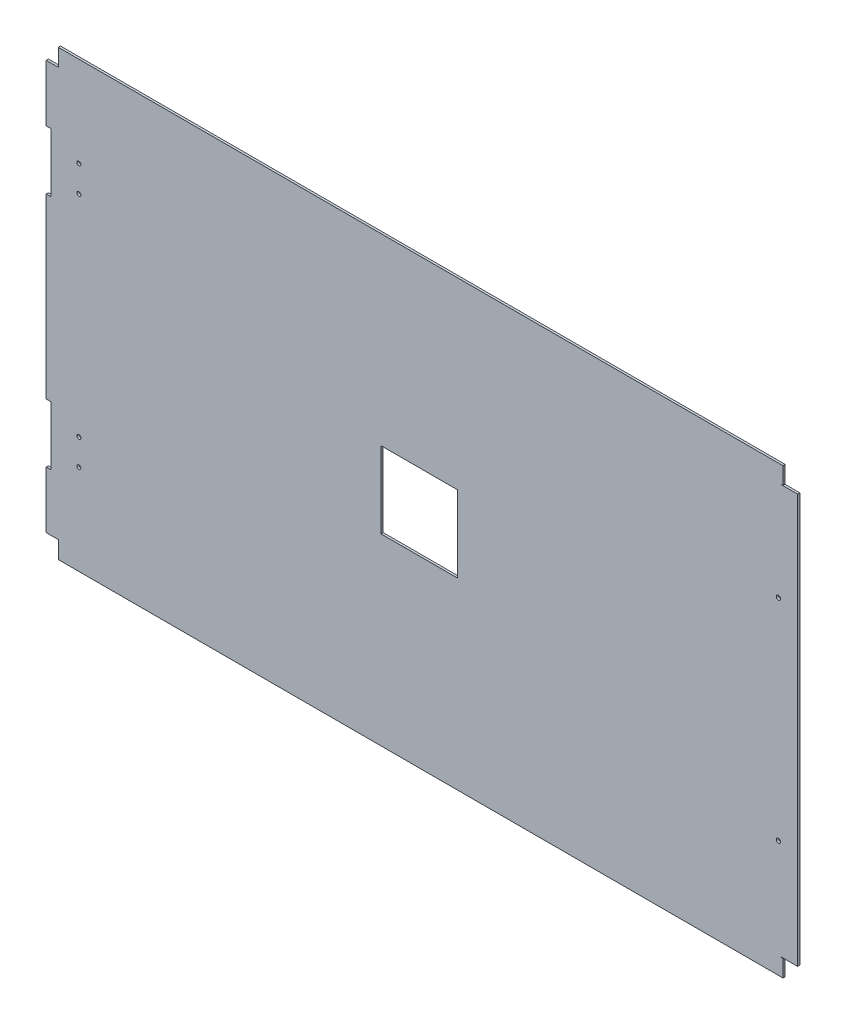
ISO-10303-21;
HEADER;
FILE_DESCRIPTION(('STEP AP214'),'2;1');
FILE_NAME('part.step','',(''),(''),'','','');
FILE_SCHEMA(('AUTOMOTIVE_DESIGN { 1 0 10303 214 1 1 1 1 }'));
ENDSEC;
DATA;
#1=APPLICATION_CONTEXT('core data for automotive mechanical design processes');
#2=APPLICATION_PROTOCOL_DEFINITION('international standard','automotive_design',2000,#1);
#3=PRODUCT_CONTEXT('',#1,'mechanical');
#4=PRODUCT('Part','Part','',(#3));
#5=PRODUCT_RELATED_PRODUCT_CATEGORY('part','',(#4));
#6=PRODUCT_DEFINITION_FORMATION('','',#4);
#7=PRODUCT_DEFINITION_CONTEXT('part definition',#1,'design');
#8=PRODUCT_DEFINITION('design','',#6,#7);
#9=PRODUCT_DEFINITION_SHAPE('','',#8);
#10=(LENGTH_UNIT() NAMED_UNIT(*) SI_UNIT(.MILLI.,.METRE.));
#11=(NAMED_UNIT(*) PLANE_ANGLE_UNIT() SI_UNIT($,.RADIAN.));
#12=(NAMED_UNIT(*) SI_UNIT($,.STERADIAN.) SOLID_ANGLE_UNIT());
#13=UNCERTAINTY_MEASURE_WITH_UNIT(LENGTH_MEASURE(1.E-05),#10,'distance_accuracy_value','');
#14=(GEOMETRIC_REPRESENTATION_CONTEXT(3) GLOBAL_UNCERTAINTY_ASSIGNED_CONTEXT((#13)) GLOBAL_UNIT_ASSIGNED_CONTEXT((#10,
#11,#12)) REPRESENTATION_CONTEXT('',''));
#15=CARTESIAN_POINT('',(0.,0.,0.));
#16=DIRECTION('',(0.,0.,1.));
#17=DIRECTION('',(1.,0.,0.));
#18=AXIS2_PLACEMENT_3D('',#15,#16,#17);
#19=CARTESIAN_POINT('',(0.,0.,-2.667));
#20=DIRECTION('',(0.,0.,-1.));
#21=DIRECTION('',(-1.,0.,0.));
#22=AXIS2_PLACEMENT_3D('',#19,#20,#21);
#23=PLANE('',#22);
#24=CARTESIAN_POINT('',(433.451,-127.,-2.667));
#25=DIRECTION('',(0.,0.,-1.));
#26=DIRECTION('',(-1.,0.,0.));
#27=AXIS2_PLACEMENT_3D('',#24,#25,#26);
#28=CIRCLE('',#27,2.54000000000001);
#29=CARTESIAN_POINT('',(430.911,-127.,-2.667));
#30=VERTEX_POINT('',#29);
#31=EDGE_CURVE('E467',#30,#30,#28,.F.);
#32=ORIENTED_EDGE('',*,*,#31,.T.);
#33=EDGE_LOOP('',(#32));
#34=FACE_BOUND('',#33,.T.);
#35=CARTESIAN_POINT('',(433.451,127.,-2.667));
#36=DIRECTION('',(0.,0.,-1.));
#37=DIRECTION('',(-1.,0.,0.));
#38=AXIS2_PLACEMENT_3D('',#35,#36,#37);
#39=CIRCLE('',#38,2.54000000000001);
#40=CARTESIAN_POINT('',(430.911,127.,-2.667));
#41=VERTEX_POINT('',#40);
#42=EDGE_CURVE('E461',#41,#41,#39,.F.);
#43=ORIENTED_EDGE('',*,*,#42,.T.);
#44=EDGE_LOOP('',(#43));
#45=FACE_BOUND('',#44,.T.);
#46=CARTESIAN_POINT('',(-410.845,-158.75,-2.667));
#47=DIRECTION('',(0.,0.,-1.));
#48=DIRECTION('',(-1.,0.,0.));
#49=AXIS2_PLACEMENT_3D('',#46,#47,#48);
#50=CIRCLE('',#49,2.413);
#51=CARTESIAN_POINT('',(-413.258,-158.75,-2.667));
#52=VERTEX_POINT('',#51);
#53=EDGE_CURVE('E455',#52,#52,#50,.F.);
#54=ORIENTED_EDGE('',*,*,#53,.T.);
#55=EDGE_LOOP('',(#54));
#56=FACE_BOUND('',#55,.T.);
#57=CARTESIAN_POINT('',(-410.845,-127.,-2.667));
#58=DIRECTION('',(0.,0.,-1.));
#59=DIRECTION('',(-1.,0.,0.));
#60=AXIS2_PLACEMENT_3D('',#57,#58,#59);
#61=CIRCLE('',#60,2.413);
#62=CARTESIAN_POINT('',(-413.258,-127.,-2.667));
#63=VERTEX_POINT('',#62);
#64=EDGE_CURVE('E449',#63,#63,#61,.F.);
#65=ORIENTED_EDGE('',*,*,#64,.T.);
#66=EDGE_LOOP('',(#65));
#67=FACE_BOUND('',#66,.T.);
#68=CARTESIAN_POINT('',(-410.845,127.,-2.667));
#69=DIRECTION('',(0.,0.,-1.));
#70=DIRECTION('',(-1.,0.,0.));
#71=AXIS2_PLACEMENT_3D('',#68,#69,#70);
#72=CIRCLE('',#71,2.413);
#73=CARTESIAN_POINT('',(-413.258,127.,-2.667));
#74=VERTEX_POINT('',#73);
#75=EDGE_CURVE('E443',#74,#74,#72,.F.);
#76=ORIENTED_EDGE('',*,*,#75,.T.);
#77=EDGE_LOOP('',(#76));
#78=FACE_BOUND('',#77,.T.);
#79=CARTESIAN_POINT('',(-410.845,158.75,-2.667));
#80=DIRECTION('',(0.,0.,-1.));
#81=DIRECTION('',(-1.,0.,0.));
#82=AXIS2_PLACEMENT_3D('',#79,#80,#81);
#83=CIRCLE('',#82,2.413);
#84=CARTESIAN_POINT('',(-413.258,158.75,-2.667));
#85=VERTEX_POINT('',#84);
#86=EDGE_CURVE('E436',#85,#85,#83,.F.);
#87=ORIENTED_EDGE('',*,*,#86,.T.);
#88=EDGE_LOOP('',(#87));
#89=FACE_BOUND('',#88,.T.);
#90=DIRECTION('',(0.,1.,0.));
#91=VECTOR('',#90,1.);
#92=CARTESIAN_POINT('',(45.9740000000002,-46.101,-2.667));
#93=LINE('',#92,#91);
#94=CARTESIAN_POINT('',(45.9740000000002,-46.101,-2.667));
#95=VERTEX_POINT('',#94);
#96=CARTESIAN_POINT('',(45.9740000000002,46.1009999999999,-2.667));
#97=VERTEX_POINT('',#96);
#98=EDGE_CURVE('E477',#95,#97,#93,.T.);
#99=ORIENTED_EDGE('',*,*,#98,.T.);
#100=DIRECTION('',(-1.,0.,0.));
#101=VECTOR('',#100,1.);
#102=CARTESIAN_POINT('',(-46.2279999999998,46.1009999999999,-2.667));
#103=LINE('',#102,#101);
#104=CARTESIAN_POINT('',(-46.2279999999998,46.1009999999999,-2.667));
#105=VERTEX_POINT('',#104);
#106=EDGE_CURVE('E492',#97,#105,#103,.T.);
#107=ORIENTED_EDGE('',*,*,#106,.T.);
#108=DIRECTION('',(0.,-1.,0.));
#109=VECTOR('',#108,1.);
#110=CARTESIAN_POINT('',(-46.2279999999998,-46.101,-2.667));
#111=LINE('',#110,#109);
#112=CARTESIAN_POINT('',(-46.2279999999998,-46.101,-2.667));
#113=VERTEX_POINT('',#112);
#114=EDGE_CURVE('E439',#105,#113,#111,.T.);
#115=ORIENTED_EDGE('',*,*,#114,.T.);
#116=DIRECTION('',(1.,0.,0.));
#117=VECTOR('',#116,1.);
#118=CARTESIAN_POINT('',(-46.2279999999998,-46.101,-2.667));
#119=LINE('',#118,#117);
#120=EDGE_CURVE('E474',#113,#95,#119,.T.);
#121=ORIENTED_EDGE('',*,*,#120,.T.);
#122=EDGE_LOOP('',(#99,#107,#115,#121));
#123=FACE_BOUND('',#122,.T.);
#124=DIRECTION('',(-1.,0.,0.));
#125=VECTOR('',#124,1.);
#126=CARTESIAN_POINT('',(-442.087,-246.888,-2.667));
#127=LINE('',#126,#125);
#128=CARTESIAN_POINT('',(-435.737,-246.888,-2.667));
#129=VERTEX_POINT('',#128);
#130=CARTESIAN_POINT('',(-450.277291291236,-246.888,-2.66699999999992));
#131=VERTEX_POINT('',#130);
#132=EDGE_CURVE('E539',#129,#131,#127,.T.);
#133=ORIENTED_EDGE('',*,*,#132,.T.);
#134=DIRECTION('',(0.,-1.,0.));
#135=VECTOR('',#134,1.);
#136=CARTESIAN_POINT('',(-450.277291291236,0.,-2.66699999999992));
#137=LINE('',#136,#135);
#138=CARTESIAN_POINT('',(-450.277291291236,-178.308,-2.66699999999992));
#139=VERTEX_POINT('',#138);
#140=EDGE_CURVE('E374',#131,#139,#137,.F.);
#141=ORIENTED_EDGE('',*,*,#140,.T.);
#142=DIRECTION('',(-1.,0.,0.));
#143=VECTOR('',#142,1.);
#144=CARTESIAN_POINT('',(-450.277291291236,-178.308,-2.66699999999992));
#145=LINE('',#144,#143);
#146=CARTESIAN_POINT('',(-444.435291291236,-178.308,-2.66700000000009));
#147=VERTEX_POINT('',#146);
#148=EDGE_CURVE('E420',#147,#139,#145,.T.);
#149=ORIENTED_EDGE('',*,*,#148,.F.);
#150=DIRECTION('',(0.,-1.,0.));
#151=VECTOR('',#150,1.);
#152=CARTESIAN_POINT('',(-444.435291291236,-178.308,-2.66700000000009));
#153=LINE('',#152,#151);
#154=CARTESIAN_POINT('',(-444.435291291236,-107.188,-2.66700000000009));
#155=VERTEX_POINT('',#154);
#156=EDGE_CURVE('E427',#155,#147,#153,.T.);
#157=ORIENTED_EDGE('',*,*,#156,.F.);
#158=DIRECTION('',(1.,0.,0.));
#159=VECTOR('',#158,1.);
#160=CARTESIAN_POINT('',(-450.277291291236,-107.188,-2.66699999999992));
#161=LINE('',#160,#159);
#162=CARTESIAN_POINT('',(-450.277291291236,-107.188,-2.66699999999992));
#163=VERTEX_POINT('',#162);
#164=EDGE_CURVE('E361',#163,#155,#161,.T.);
#165=ORIENTED_EDGE('',*,*,#164,.F.);
#166=CARTESIAN_POINT('',(-450.277291291236,107.188,-2.66699999999992));
#167=VERTEX_POINT('',#166);
#168=EDGE_CURVE('E378',#163,#167,#137,.F.);
#169=ORIENTED_EDGE('',*,*,#168,.T.);
#170=DIRECTION('',(-1.,0.,0.));
#171=VECTOR('',#170,1.);
#172=CARTESIAN_POINT('',(-450.277291291236,107.188,-2.66699999999992));
#173=LINE('',#172,#171);
#174=CARTESIAN_POINT('',(-444.435291291236,107.188,-2.66700000000009));
#175=VERTEX_POINT('',#174);
#176=EDGE_CURVE('E394',#175,#167,#173,.T.);
#177=ORIENTED_EDGE('',*,*,#176,.F.);
#178=DIRECTION('',(0.,-1.,0.));
#179=VECTOR('',#178,1.);
#180=CARTESIAN_POINT('',(-444.435291291236,178.308,-2.66700000000009));
#181=LINE('',#180,#179);
#182=CARTESIAN_POINT('',(-444.435291291236,178.308,-2.66700000000009));
#183=VERTEX_POINT('',#182);
#184=EDGE_CURVE('E401',#183,#175,#181,.T.);
#185=ORIENTED_EDGE('',*,*,#184,.F.);
#186=DIRECTION('',(1.,0.,0.));
#187=VECTOR('',#186,1.);
#188=CARTESIAN_POINT('',(-450.277291291236,178.308,-2.66699999999992));
#189=LINE('',#188,#187);
#190=CARTESIAN_POINT('',(-450.277291291236,178.308,-2.66699999999992));
#191=VERTEX_POINT('',#190);
#192=EDGE_CURVE('E408',#191,#183,#189,.T.);
#193=ORIENTED_EDGE('',*,*,#192,.F.);
#194=CARTESIAN_POINT('',(-450.277291291236,246.888,-2.66699999999992));
#195=VERTEX_POINT('',#194);
#196=EDGE_CURVE('E377',#191,#195,#137,.F.);
#197=ORIENTED_EDGE('',*,*,#196,.T.);
#198=DIRECTION('',(1.,0.,0.));
#199=VECTOR('',#198,1.);
#200=CARTESIAN_POINT('',(-442.087,246.888,-2.667));
#201=LINE('',#200,#199);
#202=CARTESIAN_POINT('',(-435.737,246.888,-2.667));
#203=VERTEX_POINT('',#202);
#204=EDGE_CURVE('E549',#195,#203,#201,.T.);
#205=ORIENTED_EDGE('',*,*,#204,.T.);
#206=DIRECTION('',(0.,1.,0.));
#207=VECTOR('',#206,1.);
#208=CARTESIAN_POINT('',(-435.737,253.238,-2.667));
#209=LINE('',#208,#207);
#210=CARTESIAN_POINT('',(-435.737,267.778291291236,-2.66699999999986));
#211=VERTEX_POINT('',#210);
#212=EDGE_CURVE('E331',#203,#211,#209,.T.);
#213=ORIENTED_EDGE('',*,*,#212,.T.);
#214=DIRECTION('',(1.,0.,0.));
#215=VECTOR('',#214,1.);
#216=CARTESIAN_POINT('',(-435.737,267.778291291236,-2.66699999999986));
#217=LINE('',#216,#215);
#218=CARTESIAN_POINT('',(439.039,267.778291291236,-2.66699999999986));
#219=VERTEX_POINT('',#218);
#220=EDGE_CURVE('E329',#219,#211,#217,.F.);
#221=ORIENTED_EDGE('',*,*,#220,.F.);
#222=DIRECTION('',(0.,-1.,0.));
#223=VECTOR('',#222,1.);
#224=CARTESIAN_POINT('',(439.039,253.238,-2.667));
#225=LINE('',#224,#223);
#226=CARTESIAN_POINT('',(439.039,247.1547,-2.667));
#227=VERTEX_POINT('',#226);
#228=EDGE_CURVE('E315',#219,#227,#225,.T.);
#229=ORIENTED_EDGE('',*,*,#228,.T.);
#230=DIRECTION('',(1.,0.,0.));
#231=VECTOR('',#230,1.);
#232=CARTESIAN_POINT('',(436.4863,247.1547,-2.66699999999998));
#233=LINE('',#232,#231);
#234=CARTESIAN_POINT('',(436.4863,247.1547,-2.667));
#235=VERTEX_POINT('',#234);
#236=EDGE_CURVE('E518',#235,#227,#233,.T.);
#237=ORIENTED_EDGE('',*,*,#236,.F.);
#238=DIRECTION('',(0.,1.,0.));
#239=VECTOR('',#238,1.);
#240=CARTESIAN_POINT('',(436.4863,246.888,-2.66699999999998));
#241=LINE('',#240,#239);
#242=CARTESIAN_POINT('',(436.4863,246.888,-2.667));
#243=VERTEX_POINT('',#242);
#244=EDGE_CURVE('E514',#243,#235,#241,.T.);
#245=ORIENTED_EDGE('',*,*,#244,.F.);
#246=DIRECTION('',(-1.,0.,0.));
#247=VECTOR('',#246,1.);
#248=CARTESIAN_POINT('',(436.753,246.888,-2.66699999999998));
#249=LINE('',#248,#247);
#250=CARTESIAN_POINT('',(456.627291291236,246.888,-2.66699999999986));
#251=VERTEX_POINT('',#250);
#252=EDGE_CURVE('E511',#251,#243,#249,.T.);
#253=ORIENTED_EDGE('',*,*,#252,.F.);
#254=DIRECTION('',(0.,-1.,0.));
#255=VECTOR('',#254,1.);
#256=CARTESIAN_POINT('',(456.627291291236,246.888,-2.66699999999986));
#257=LINE('',#256,#255);
#258=CARTESIAN_POINT('',(456.627291291236,-246.888,-2.66699999999981));
#259=VERTEX_POINT('',#258);
#260=EDGE_CURVE('E355',#259,#251,#257,.F.);
#261=ORIENTED_EDGE('',*,*,#260,.F.);
#262=DIRECTION('',(1.,0.,0.));
#263=VECTOR('',#262,1.);
#264=CARTESIAN_POINT('',(436.4863,-246.888,-2.66699999999998));
#265=LINE('',#264,#263);
#266=CARTESIAN_POINT('',(436.4863,-246.888,-2.667));
#267=VERTEX_POINT('',#266);
#268=EDGE_CURVE('E508',#267,#259,#265,.T.);
#269=ORIENTED_EDGE('',*,*,#268,.F.);
#270=DIRECTION('',(0.,1.,0.));
#271=VECTOR('',#270,1.);
#272=CARTESIAN_POINT('',(436.4863,-247.1547,-2.66699999999998));
#273=LINE('',#272,#271);
#274=CARTESIAN_POINT('',(436.4863,-247.1547,-2.667));
#275=VERTEX_POINT('',#274);
#276=EDGE_CURVE('E504',#275,#267,#273,.T.);
#277=ORIENTED_EDGE('',*,*,#276,.F.);
#278=DIRECTION('',(-1.,0.,0.));
#279=VECTOR('',#278,1.);
#280=CARTESIAN_POINT('',(442.087,-247.1547,-2.66699999999998));
#281=LINE('',#280,#279);
#282=CARTESIAN_POINT('',(439.039,-247.1547,-2.66699999999998));
#283=VERTEX_POINT('',#282);
#284=EDGE_CURVE('E500',#283,#275,#281,.T.);
#285=ORIENTED_EDGE('',*,*,#284,.F.);
#286=DIRECTION('',(0.,-1.,0.));
#287=VECTOR('',#286,1.);
#288=CARTESIAN_POINT('',(439.039,-253.238,-2.667));
#289=LINE('',#288,#287);
#290=CARTESIAN_POINT('',(439.039,-267.778291291236,-2.66699999999986));
#291=VERTEX_POINT('',#290);
#292=EDGE_CURVE('E533',#283,#291,#289,.T.);
#293=ORIENTED_EDGE('',*,*,#292,.T.);
#294=DIRECTION('',(-1.,0.,0.));
#295=VECTOR('',#294,1.);
#296=CARTESIAN_POINT('',(439.039,-267.778291291236,-2.66699999999986));
#297=LINE('',#296,#295);
#298=CARTESIAN_POINT('',(-435.737,-267.778291291236,-2.66699999999986));
#299=VERTEX_POINT('',#298);
#300=EDGE_CURVE('E348',#299,#291,#297,.F.);
#301=ORIENTED_EDGE('',*,*,#300,.F.);
#302=DIRECTION('',(0.,1.,0.));
#303=VECTOR('',#302,1.);
#304=CARTESIAN_POINT('',(-435.737,-253.238,-2.667));
#305=LINE('',#304,#303);
#306=EDGE_CURVE('E543',#299,#129,#305,.T.);
#307=ORIENTED_EDGE('',*,*,#306,.T.);
#308=EDGE_LOOP('',(#133,#141,#149,#157,#165,#169,#177,#185,#193,#197,#205,#213,#221,#229,#237,
#245,#253,#261,#269,#277,#285,#293,#301,#307));
#309=FACE_BOUND('',#308,.T.);
#310=ADVANCED_FACE('F129',(#34,#45,#56,#67,#78,#89,#123,#309),#23,.T.);
#311=CARTESIAN_POINT('',(0.,0.,0.));
#312=DIRECTION('',(0.,0.,-1.));
#313=DIRECTION('',(-1.,0.,0.));
#314=AXIS2_PLACEMENT_3D('',#311,#312,#313);
#315=PLANE('',#314);
#316=CARTESIAN_POINT('',(433.451,-127.,0.));
#317=DIRECTION('',(0.,0.,1.));
#318=DIRECTION('',(1.,0.,0.));
#319=AXIS2_PLACEMENT_3D('',#316,#317,#318);
#320=CIRCLE('',#319,2.54000000000001);
#321=CARTESIAN_POINT('',(435.991,-127.,0.));
#322=VERTEX_POINT('',#321);
#323=EDGE_CURVE('E373',#322,#322,#320,.T.);
#324=ORIENTED_EDGE('',*,*,#323,.F.);
#325=EDGE_LOOP('',(#324));
#326=FACE_BOUND('',#325,.T.);
#327=CARTESIAN_POINT('',(433.451,127.,0.));
#328=DIRECTION('',(0.,0.,1.));
#329=DIRECTION('',(1.,0.,0.));
#330=AXIS2_PLACEMENT_3D('',#327,#328,#329);
#331=CIRCLE('',#330,2.54000000000001);
#332=CARTESIAN_POINT('',(435.991,127.,0.));
#333=VERTEX_POINT('',#332);
#334=EDGE_CURVE('E464',#333,#333,#331,.T.);
#335=ORIENTED_EDGE('',*,*,#334,.F.);
#336=EDGE_LOOP('',(#335));
#337=FACE_BOUND('',#336,.T.);
#338=CARTESIAN_POINT('',(-410.845,-158.75,0.));
#339=DIRECTION('',(0.,0.,1.));
#340=DIRECTION('',(1.,0.,0.));
#341=AXIS2_PLACEMENT_3D('',#338,#339,#340);
#342=CIRCLE('',#341,2.413);
#343=CARTESIAN_POINT('',(-408.432,-158.75,0.));
#344=VERTEX_POINT('',#343);
#345=EDGE_CURVE('E458',#344,#344,#342,.T.);
#346=ORIENTED_EDGE('',*,*,#345,.F.);
#347=EDGE_LOOP('',(#346));
#348=FACE_BOUND('',#347,.T.);
#349=CARTESIAN_POINT('',(-410.845,-127.,0.));
#350=DIRECTION('',(0.,0.,1.));
#351=DIRECTION('',(1.,0.,0.));
#352=AXIS2_PLACEMENT_3D('',#349,#350,#351);
#353=CIRCLE('',#352,2.413);
#354=CARTESIAN_POINT('',(-408.432,-127.,0.));
#355=VERTEX_POINT('',#354);
#356=EDGE_CURVE('E452',#355,#355,#353,.T.);
#357=ORIENTED_EDGE('',*,*,#356,.F.);
#358=EDGE_LOOP('',(#357));
#359=FACE_BOUND('',#358,.T.);
#360=CARTESIAN_POINT('',(-410.845,127.,0.));
#361=DIRECTION('',(0.,0.,1.));
#362=DIRECTION('',(1.,0.,0.));
#363=AXIS2_PLACEMENT_3D('',#360,#361,#362);
#364=CIRCLE('',#363,2.413);
#365=CARTESIAN_POINT('',(-408.432,127.,0.));
#366=VERTEX_POINT('',#365);
#367=EDGE_CURVE('E446',#366,#366,#364,.T.);
#368=ORIENTED_EDGE('',*,*,#367,.F.);
#369=EDGE_LOOP('',(#368));
#370=FACE_BOUND('',#369,.T.);
#371=CARTESIAN_POINT('',(-410.845,158.75,0.));
#372=DIRECTION('',(0.,0.,1.));
#373=DIRECTION('',(1.,0.,0.));
#374=AXIS2_PLACEMENT_3D('',#371,#372,#373);
#375=CIRCLE('',#374,2.413);
#376=CARTESIAN_POINT('',(-408.432,158.75,0.));
#377=VERTEX_POINT('',#376);
#378=EDGE_CURVE('E440',#377,#377,#375,.T.);
#379=ORIENTED_EDGE('',*,*,#378,.F.);
#380=EDGE_LOOP('',(#379));
#381=FACE_BOUND('',#380,.T.);
#382=DIRECTION('',(-1.,0.,0.));
#383=VECTOR('',#382,1.);
#384=CARTESIAN_POINT('',(-46.2279999999998,46.1009999999999,0.));
#385=LINE('',#384,#383);
#386=CARTESIAN_POINT('',(45.9740000000002,46.1009999999999,0.));
#387=VERTEX_POINT('',#386);
#388=CARTESIAN_POINT('',(-46.2279999999998,46.1009999999999,0.));
#389=VERTEX_POINT('',#388);
#390=EDGE_CURVE('E481',#387,#389,#385,.T.);
#391=ORIENTED_EDGE('',*,*,#390,.F.);
#392=DIRECTION('',(0.,1.,0.));
#393=VECTOR('',#392,1.);
#394=CARTESIAN_POINT('',(45.9740000000002,-46.101,0.));
#395=LINE('',#394,#393);
#396=CARTESIAN_POINT('',(45.9740000000002,-46.101,0.));
#397=VERTEX_POINT('',#396);
#398=EDGE_CURVE('E152',#397,#387,#395,.T.);
#399=ORIENTED_EDGE('',*,*,#398,.F.);
#400=DIRECTION('',(1.,0.,0.));
#401=VECTOR('',#400,1.);
#402=CARTESIAN_POINT('',(-46.2279999999998,-46.101,0.));
#403=LINE('',#402,#401);
#404=CARTESIAN_POINT('',(-46.2279999999998,-46.101,0.));
#405=VERTEX_POINT('',#404);
#406=EDGE_CURVE('E486',#405,#397,#403,.T.);
#407=ORIENTED_EDGE('',*,*,#406,.F.);
#408=DIRECTION('',(0.,-1.,0.));
#409=VECTOR('',#408,1.);
#410=CARTESIAN_POINT('',(-46.2279999999998,-46.101,0.));
#411=LINE('',#410,#409);
#412=EDGE_CURVE('E483',#389,#405,#411,.T.);
#413=ORIENTED_EDGE('',*,*,#412,.F.);
#414=EDGE_LOOP('',(#391,#399,#407,#413));
#415=FACE_BOUND('',#414,.T.);
#416=DIRECTION('',(1.,0.,0.));
#417=VECTOR('',#416,1.);
#418=CARTESIAN_POINT('',(-442.087,246.888,0.));
#419=LINE('',#418,#417);
#420=CARTESIAN_POINT('',(-450.277291291236,246.888,0.));
#421=VERTEX_POINT('',#420);
#422=CARTESIAN_POINT('',(-435.737,246.888,0.));
#423=VERTEX_POINT('',#422);
#424=EDGE_CURVE('E545',#421,#423,#419,.T.);
#425=ORIENTED_EDGE('',*,*,#424,.F.);
#426=DIRECTION('',(0.,1.,0.));
#427=VECTOR('',#426,1.);
#428=CARTESIAN_POINT('',(-450.277291291236,246.888,0.));
#429=LINE('',#428,#427);
#430=CARTESIAN_POINT('',(-450.277291291236,178.308,0.));
#431=VERTEX_POINT('',#430);
#432=EDGE_CURVE('E384',#431,#421,#429,.T.);
#433=ORIENTED_EDGE('',*,*,#432,.F.);
#434=DIRECTION('',(-1.,0.,0.));
#435=VECTOR('',#434,1.);
#436=CARTESIAN_POINT('',(-450.277291291236,178.308,0.));
#437=LINE('',#436,#435);
#438=CARTESIAN_POINT('',(-444.435291291236,178.308,0.));
#439=VERTEX_POINT('',#438);
#440=EDGE_CURVE('E404',#439,#431,#437,.T.);
#441=ORIENTED_EDGE('',*,*,#440,.F.);
#442=DIRECTION('',(0.,1.,0.));
#443=VECTOR('',#442,1.);
#444=CARTESIAN_POINT('',(-444.435291291236,178.308,0.));
#445=LINE('',#444,#443);
#446=CARTESIAN_POINT('',(-444.435291291236,107.188,0.));
#447=VERTEX_POINT('',#446);
#448=EDGE_CURVE('E396',#447,#439,#445,.T.);
#449=ORIENTED_EDGE('',*,*,#448,.F.);
#450=DIRECTION('',(1.,0.,0.));
#451=VECTOR('',#450,1.);
#452=CARTESIAN_POINT('',(-450.277291291236,107.188,0.));
#453=LINE('',#452,#451);
#454=CARTESIAN_POINT('',(-450.277291291236,107.188,0.));
#455=VERTEX_POINT('',#454);
#456=EDGE_CURVE('E389',#455,#447,#453,.T.);
#457=ORIENTED_EDGE('',*,*,#456,.F.);
#458=CARTESIAN_POINT('',(-450.277291291236,-107.188,0.));
#459=VERTEX_POINT('',#458);
#460=EDGE_CURVE('E385',#459,#455,#429,.T.);
#461=ORIENTED_EDGE('',*,*,#460,.F.);
#462=DIRECTION('',(-1.,0.,0.));
#463=VECTOR('',#462,1.);
#464=CARTESIAN_POINT('',(-450.277291291236,-107.188,0.));
#465=LINE('',#464,#463);
#466=CARTESIAN_POINT('',(-444.435291291236,-107.188,0.));
#467=VERTEX_POINT('',#466);
#468=EDGE_CURVE('E430',#467,#459,#465,.T.);
#469=ORIENTED_EDGE('',*,*,#468,.F.);
#470=DIRECTION('',(0.,1.,0.));
#471=VECTOR('',#470,1.);
#472=CARTESIAN_POINT('',(-444.435291291236,-178.308,0.));
#473=LINE('',#472,#471);
#474=CARTESIAN_POINT('',(-444.435291291236,-178.308,0.));
#475=VERTEX_POINT('',#474);
#476=EDGE_CURVE('E422',#475,#467,#473,.T.);
#477=ORIENTED_EDGE('',*,*,#476,.F.);
#478=DIRECTION('',(1.,0.,0.));
#479=VECTOR('',#478,1.);
#480=CARTESIAN_POINT('',(-450.277291291236,-178.308,0.));
#481=LINE('',#480,#479);
#482=CARTESIAN_POINT('',(-450.277291291236,-178.308,0.));
#483=VERTEX_POINT('',#482);
#484=EDGE_CURVE('E383',#483,#475,#481,.T.);
#485=ORIENTED_EDGE('',*,*,#484,.F.);
#486=CARTESIAN_POINT('',(-450.277291291236,-246.888,0.));
#487=VERTEX_POINT('',#486);
#488=EDGE_CURVE('E379',#487,#483,#429,.T.);
#489=ORIENTED_EDGE('',*,*,#488,.F.);
#490=DIRECTION('',(-1.,0.,0.));
#491=VECTOR('',#490,1.);
#492=CARTESIAN_POINT('',(-442.087,-246.888,0.));
#493=LINE('',#492,#491);
#494=CARTESIAN_POINT('',(-435.737,-246.888,0.));
#495=VERTEX_POINT('',#494);
#496=EDGE_CURVE('E540',#495,#487,#493,.T.);
#497=ORIENTED_EDGE('',*,*,#496,.F.);
#498=DIRECTION('',(0.,1.,0.));
#499=VECTOR('',#498,1.);
#500=CARTESIAN_POINT('',(-435.737,-253.238,0.));
#501=LINE('',#500,#499);
#502=CARTESIAN_POINT('',(-435.737,-267.778291291236,1.11022302462516E-13));
#503=VERTEX_POINT('',#502);
#504=EDGE_CURVE('E542',#503,#495,#501,.T.);
#505=ORIENTED_EDGE('',*,*,#504,.F.);
#506=DIRECTION('',(1.,0.,0.));
#507=VECTOR('',#506,1.);
#508=CARTESIAN_POINT('',(0.,-267.778291291236,1.11022302462516E-13));
#509=LINE('',#508,#507);
#510=CARTESIAN_POINT('',(439.039,-267.778291291236,1.11022302462516E-13));
#511=VERTEX_POINT('',#510);
#512=EDGE_CURVE('E358',#503,#511,#509,.T.);
#513=ORIENTED_EDGE('',*,*,#512,.T.);
#514=DIRECTION('',(0.,-1.,0.));
#515=VECTOR('',#514,1.);
#516=CARTESIAN_POINT('',(439.039,-253.238,0.));
#517=LINE('',#516,#515);
#518=CARTESIAN_POINT('',(439.039,-247.1547,0.));
#519=VERTEX_POINT('',#518);
#520=EDGE_CURVE('E326',#519,#511,#517,.T.);
#521=ORIENTED_EDGE('',*,*,#520,.F.);
#522=DIRECTION('',(1.,0.,0.));
#523=VECTOR('',#522,1.);
#524=CARTESIAN_POINT('',(0.,-247.1547,0.));
#525=LINE('',#524,#523);
#526=CARTESIAN_POINT('',(436.4863,-247.1547,0.));
#527=VERTEX_POINT('',#526);
#528=EDGE_CURVE('E503',#527,#519,#525,.T.);
#529=ORIENTED_EDGE('',*,*,#528,.F.);
#530=DIRECTION('',(0.,-1.,0.));
#531=VECTOR('',#530,1.);
#532=CARTESIAN_POINT('',(436.4863,0.,0.));
#533=LINE('',#532,#531);
#534=CARTESIAN_POINT('',(436.4863,-246.888,0.));
#535=VERTEX_POINT('',#534);
#536=EDGE_CURVE('E13',#535,#527,#533,.T.);
#537=ORIENTED_EDGE('',*,*,#536,.F.);
#538=DIRECTION('',(-1.,0.,0.));
#539=VECTOR('',#538,1.);
#540=CARTESIAN_POINT('',(0.,-246.888,0.));
#541=LINE('',#540,#539);
#542=CARTESIAN_POINT('',(456.627291291236,-246.888,1.66533453693773E-13));
#543=VERTEX_POINT('',#542);
#544=EDGE_CURVE('E137',#543,#535,#541,.T.);
#545=ORIENTED_EDGE('',*,*,#544,.F.);
#546=DIRECTION('',(0.,1.,0.));
#547=VECTOR('',#546,1.);
#548=CARTESIAN_POINT('',(456.627291291236,0.,1.11022302462516E-13));
#549=LINE('',#548,#547);
#550=CARTESIAN_POINT('',(456.627291291236,246.888,1.11022302462516E-13));
#551=VERTEX_POINT('',#550);
#552=EDGE_CURVE('E345',#543,#551,#549,.T.);
#553=ORIENTED_EDGE('',*,*,#552,.T.);
#554=DIRECTION('',(1.,0.,0.));
#555=VECTOR('',#554,1.);
#556=CARTESIAN_POINT('',(0.,246.888,0.));
#557=LINE('',#556,#555);
#558=CARTESIAN_POINT('',(436.4863,246.888,0.));
#559=VERTEX_POINT('',#558);
#560=EDGE_CURVE('E565',#559,#551,#557,.T.);
#561=ORIENTED_EDGE('',*,*,#560,.F.);
#562=DIRECTION('',(0.,-1.,0.));
#563=VECTOR('',#562,1.);
#564=CARTESIAN_POINT('',(436.4863,0.,0.));
#565=LINE('',#564,#563);
#566=CARTESIAN_POINT('',(436.4863,247.1547,0.));
#567=VERTEX_POINT('',#566);
#568=EDGE_CURVE('E562',#567,#559,#565,.T.);
#569=ORIENTED_EDGE('',*,*,#568,.F.);
#570=DIRECTION('',(-1.,0.,0.));
#571=VECTOR('',#570,1.);
#572=CARTESIAN_POINT('',(0.,247.1547,0.));
#573=LINE('',#572,#571);
#574=CARTESIAN_POINT('',(439.039,247.1547,0.));
#575=VERTEX_POINT('',#574);
#576=EDGE_CURVE('E530',#575,#567,#573,.T.);
#577=ORIENTED_EDGE('',*,*,#576,.F.);
#578=DIRECTION('',(0.,-1.,0.));
#579=VECTOR('',#578,1.);
#580=CARTESIAN_POINT('',(439.039,253.238,0.));
#581=LINE('',#580,#579);
#582=CARTESIAN_POINT('',(439.039,267.778291291236,1.11022302462516E-13));
#583=VERTEX_POINT('',#582);
#584=EDGE_CURVE('E325',#583,#575,#581,.T.);
#585=ORIENTED_EDGE('',*,*,#584,.F.);
#586=DIRECTION('',(-1.,0.,0.));
#587=VECTOR('',#586,1.);
#588=CARTESIAN_POINT('',(0.,267.778291291236,1.11022302462516E-13));
#589=LINE('',#588,#587);
#590=CARTESIAN_POINT('',(-435.737,267.778291291236,1.11022302462516E-13));
#591=VERTEX_POINT('',#590);
#592=EDGE_CURVE('E339',#583,#591,#589,.T.);
#593=ORIENTED_EDGE('',*,*,#592,.T.);
#594=DIRECTION('',(0.,1.,0.));
#595=VECTOR('',#594,1.);
#596=CARTESIAN_POINT('',(-435.737,253.238,0.));
#597=LINE('',#596,#595);
#598=EDGE_CURVE('E551',#423,#591,#597,.T.);
#599=ORIENTED_EDGE('',*,*,#598,.F.);
#600=EDGE_LOOP('',(#425,#433,#441,#449,#457,#461,#469,#477,#485,#489,#497,#505,#513,#521,#529,
#537,#545,#553,#561,#569,#577,#585,#593,#599));
#601=FACE_BOUND('',#600,.T.);
#602=ADVANCED_FACE('F131',(#326,#337,#348,#359,#370,#381,#415,#601),#315,.F.);
#603=CARTESIAN_POINT('',(-442.087,246.888,-2.667));
#604=DIRECTION('',(0.,-1.,0.));
#605=DIRECTION('',(0.,0.,-1.));
#606=AXIS2_PLACEMENT_3D('',#603,#604,#605);
#607=PLANE('',#606);
#608=ORIENTED_EDGE('',*,*,#204,.F.);
#609=DIRECTION('',(0.,0.,-1.));
#610=VECTOR('',#609,1.);
#611=CARTESIAN_POINT('',(-450.277291291236,246.888,0.));
#612=LINE('',#611,#610);
#613=EDGE_CURVE('E411',#421,#195,#612,.T.);
#614=ORIENTED_EDGE('',*,*,#613,.F.);
#615=ORIENTED_EDGE('',*,*,#424,.T.);
#616=DIRECTION('',(0.,0.,1.));
#617=VECTOR('',#616,1.);
#618=CARTESIAN_POINT('',(-435.737,246.888,-2.667));
#619=LINE('',#618,#617);
#620=EDGE_CURVE('E553',#203,#423,#619,.T.);
#621=ORIENTED_EDGE('',*,*,#620,.F.);
#622=EDGE_LOOP('',(#608,#614,#615,#621));
#623=FACE_BOUND('',#622,.T.);
#624=ADVANCED_FACE('F631',(#623),#607,.F.);
#625=CARTESIAN_POINT('',(-442.087,-246.888,-2.667));
#626=DIRECTION('',(0.,1.,0.));
#627=DIRECTION('',(0.,0.,1.));
#628=AXIS2_PLACEMENT_3D('',#625,#626,#627);
#629=PLANE('',#628);
#630=ORIENTED_EDGE('',*,*,#496,.T.);
#631=DIRECTION('',(0.,0.,-1.));
#632=VECTOR('',#631,1.);
#633=CARTESIAN_POINT('',(-450.277291291236,-246.888,0.));
#634=LINE('',#633,#632);
#635=EDGE_CURVE('E370',#487,#131,#634,.T.);
#636=ORIENTED_EDGE('',*,*,#635,.T.);
#637=ORIENTED_EDGE('',*,*,#132,.F.);
#638=DIRECTION('',(0.,0.,1.));
#639=VECTOR('',#638,1.);
#640=CARTESIAN_POINT('',(-435.737,-246.888,-2.667));
#641=LINE('',#640,#639);
#642=EDGE_CURVE('E536',#129,#495,#641,.T.);
#643=ORIENTED_EDGE('',*,*,#642,.T.);
#644=EDGE_LOOP('',(#630,#636,#637,#643));
#645=FACE_BOUND('',#644,.T.);
#646=ADVANCED_FACE('F595',(#645),#629,.F.);
#647=CARTESIAN_POINT('',(439.039,-253.238,-2.667));
#648=DIRECTION('',(-1.,0.,0.));
#649=DIRECTION('',(0.,-1.,0.));
#650=AXIS2_PLACEMENT_3D('',#647,#648,#649);
#651=PLANE('',#650);
#652=ORIENTED_EDGE('',*,*,#520,.T.);
#653=DIRECTION('',(0.,0.,-1.));
#654=VECTOR('',#653,1.);
#655=CARTESIAN_POINT('',(439.039,-267.778291291236,1.11022302462516E-13));
#656=LINE('',#655,#654);
#657=EDGE_CURVE('E362',#511,#291,#656,.T.);
#658=ORIENTED_EDGE('',*,*,#657,.T.);
#659=ORIENTED_EDGE('',*,*,#292,.F.);
#660=DIRECTION('',(0.,0.,-1.));
#661=VECTOR('',#660,1.);
#662=CARTESIAN_POINT('',(439.039,-247.1547,-2.667));
#663=LINE('',#662,#661);
#664=EDGE_CURVE('E558',#519,#283,#663,.T.);
#665=ORIENTED_EDGE('',*,*,#664,.F.);
#666=EDGE_LOOP('',(#652,#658,#659,#665));
#667=FACE_BOUND('',#666,.T.);
#668=ADVANCED_FACE('F582',(#667),#651,.F.);
#669=CARTESIAN_POINT('',(-435.737,-253.238,-2.667));
#670=DIRECTION('',(1.,0.,0.));
#671=DIRECTION('',(0.,1.,0.));
#672=AXIS2_PLACEMENT_3D('',#669,#670,#671);
#673=PLANE('',#672);
#674=ORIENTED_EDGE('',*,*,#306,.F.);
#675=DIRECTION('',(0.,0.,-1.));
#676=VECTOR('',#675,1.);
#677=CARTESIAN_POINT('',(-435.737,-267.778291291236,1.11022302462516E-13));
#678=LINE('',#677,#676);
#679=EDGE_CURVE('E365',#503,#299,#678,.T.);
#680=ORIENTED_EDGE('',*,*,#679,.F.);
#681=ORIENTED_EDGE('',*,*,#504,.T.);
#682=ORIENTED_EDGE('',*,*,#642,.F.);
#683=EDGE_LOOP('',(#674,#680,#681,#682));
#684=FACE_BOUND('',#683,.T.);
#685=ADVANCED_FACE('F593',(#684),#673,.F.);
#686=CARTESIAN_POINT('',(439.039,253.238,-2.667));
#687=DIRECTION('',(-1.,0.,0.));
#688=DIRECTION('',(0.,0.,1.));
#689=AXIS2_PLACEMENT_3D('',#686,#687,#688);
#690=PLANE('',#689);
#691=DIRECTION('',(0.,0.,1.));
#692=VECTOR('',#691,1.);
#693=CARTESIAN_POINT('',(439.039,247.1547,-2.667));
#694=LINE('',#693,#692);
#695=EDGE_CURVE('E322',#227,#575,#694,.T.);
#696=ORIENTED_EDGE('',*,*,#695,.F.);
#697=ORIENTED_EDGE('',*,*,#228,.F.);
#698=DIRECTION('',(0.,0.,-1.));
#699=VECTOR('',#698,1.);
#700=CARTESIAN_POINT('',(439.039,267.778291291236,1.11022302462516E-13));
#701=LINE('',#700,#699);
#702=EDGE_CURVE('E320',#583,#219,#701,.T.);
#703=ORIENTED_EDGE('',*,*,#702,.F.);
#704=ORIENTED_EDGE('',*,*,#584,.T.);
#705=EDGE_LOOP('',(#696,#697,#703,#704));
#706=FACE_BOUND('',#705,.T.);
#707=ADVANCED_FACE('F317',(#706),#690,.F.);
#708=CARTESIAN_POINT('',(-435.737,253.238,-2.667));
#709=DIRECTION('',(1.,0.,0.));
#710=DIRECTION('',(0.,0.,-1.));
#711=AXIS2_PLACEMENT_3D('',#708,#709,#710);
#712=PLANE('',#711);
#713=ORIENTED_EDGE('',*,*,#598,.T.);
#714=DIRECTION('',(0.,0.,-1.));
#715=VECTOR('',#714,1.);
#716=CARTESIAN_POINT('',(-435.737,267.778291291236,1.11022302462516E-13));
#717=LINE('',#716,#715);
#718=EDGE_CURVE('E340',#591,#211,#717,.T.);
#719=ORIENTED_EDGE('',*,*,#718,.T.);
#720=ORIENTED_EDGE('',*,*,#212,.F.);
#721=ORIENTED_EDGE('',*,*,#620,.T.);
#722=EDGE_LOOP('',(#713,#719,#720,#721));
#723=FACE_BOUND('',#722,.T.);
#724=ADVANCED_FACE('F662',(#723),#712,.F.);
#725=CARTESIAN_POINT('',(436.4863,-247.1547,-2.66699999999998));
#726=DIRECTION('',(1.,0.,0.));
#727=DIRECTION('',(0.,0.,-1.));
#728=AXIS2_PLACEMENT_3D('',#725,#726,#727);
#729=PLANE('',#728);
#730=DIRECTION('',(0.,0.,1.));
#731=VECTOR('',#730,1.);
#732=CARTESIAN_POINT('',(436.4863,-246.888,-2.66699999999998));
#733=LINE('',#732,#731);
#734=EDGE_CURVE('E510',#267,#535,#733,.T.);
#735=ORIENTED_EDGE('',*,*,#734,.T.);
#736=ORIENTED_EDGE('',*,*,#536,.T.);
#737=DIRECTION('',(0.,0.,1.));
#738=VECTOR('',#737,1.);
#739=CARTESIAN_POINT('',(436.4863,-247.1547,-2.66699999999998));
#740=LINE('',#739,#738);
#741=EDGE_CURVE('E507',#275,#527,#740,.T.);
#742=ORIENTED_EDGE('',*,*,#741,.F.);
#743=ORIENTED_EDGE('',*,*,#276,.T.);
#744=EDGE_LOOP('',(#735,#736,#742,#743));
#745=FACE_BOUND('',#744,.T.);
#746=ADVANCED_FACE('F574',(#745),#729,.T.);
#747=CARTESIAN_POINT('',(436.4863,-246.888,-2.66699999999998));
#748=DIRECTION('',(0.,-1.,0.));
#749=DIRECTION('',(0.,0.,-1.));
#750=AXIS2_PLACEMENT_3D('',#747,#748,#749);
#751=PLANE('',#750);
#752=ORIENTED_EDGE('',*,*,#268,.T.);
#753=DIRECTION('',(0.,0.,-1.));
#754=VECTOR('',#753,1.);
#755=CARTESIAN_POINT('',(456.627291291236,-246.888,1.66533453693773E-13));
#756=LINE('',#755,#754);
#757=EDGE_CURVE('E352',#543,#259,#756,.T.);
#758=ORIENTED_EDGE('',*,*,#757,.F.);
#759=ORIENTED_EDGE('',*,*,#544,.T.);
#760=ORIENTED_EDGE('',*,*,#734,.F.);
#761=EDGE_LOOP('',(#752,#758,#759,#760));
#762=FACE_BOUND('',#761,.T.);
#763=ADVANCED_FACE('F570',(#762),#751,.T.);
#764=CARTESIAN_POINT('',(436.753,246.888,-2.66699999999998));
#765=DIRECTION('',(0.,1.,0.));
#766=DIRECTION('',(0.,0.,1.));
#767=AXIS2_PLACEMENT_3D('',#764,#765,#766);
#768=PLANE('',#767);
#769=DIRECTION('',(0.,0.,1.));
#770=VECTOR('',#769,1.);
#771=CARTESIAN_POINT('',(436.4863,246.888,-2.66699999999998));
#772=LINE('',#771,#770);
#773=EDGE_CURVE('E517',#243,#559,#772,.T.);
#774=ORIENTED_EDGE('',*,*,#773,.T.);
#775=ORIENTED_EDGE('',*,*,#560,.T.);
#776=DIRECTION('',(0.,0.,-1.));
#777=VECTOR('',#776,1.);
#778=CARTESIAN_POINT('',(456.627291291236,246.888,1.11022302462516E-13));
#779=LINE('',#778,#777);
#780=EDGE_CURVE('E349',#551,#251,#779,.T.);
#781=ORIENTED_EDGE('',*,*,#780,.T.);
#782=ORIENTED_EDGE('',*,*,#252,.T.);
#783=EDGE_LOOP('',(#774,#775,#781,#782));
#784=FACE_BOUND('',#783,.T.);
#785=ADVANCED_FACE('F682',(#784),#768,.T.);
#786=CARTESIAN_POINT('',(436.4863,246.888,-2.66699999999998));
#787=DIRECTION('',(1.,0.,0.));
#788=DIRECTION('',(0.,0.,-1.));
#789=AXIS2_PLACEMENT_3D('',#786,#787,#788);
#790=PLANE('',#789);
#791=DIRECTION('',(0.,0.,1.));
#792=VECTOR('',#791,1.);
#793=CARTESIAN_POINT('',(436.4863,247.1547,-2.66699999999998));
#794=LINE('',#793,#792);
#795=EDGE_CURVE('E499',#235,#567,#794,.T.);
#796=ORIENTED_EDGE('',*,*,#795,.T.);
#797=ORIENTED_EDGE('',*,*,#568,.T.);
#798=ORIENTED_EDGE('',*,*,#773,.F.);
#799=ORIENTED_EDGE('',*,*,#244,.T.);
#800=EDGE_LOOP('',(#796,#797,#798,#799));
#801=FACE_BOUND('',#800,.T.);
#802=ADVANCED_FACE('F685',(#801),#790,.T.);
#803=CARTESIAN_POINT('',(436.4863,247.1547,-2.66699999999998));
#804=DIRECTION('',(0.,-1.,0.));
#805=DIRECTION('',(0.,0.,-1.));
#806=AXIS2_PLACEMENT_3D('',#803,#804,#805);
#807=PLANE('',#806);
#808=ORIENTED_EDGE('',*,*,#695,.T.);
#809=ORIENTED_EDGE('',*,*,#576,.T.);
#810=ORIENTED_EDGE('',*,*,#795,.F.);
#811=ORIENTED_EDGE('',*,*,#236,.T.);
#812=EDGE_LOOP('',(#808,#809,#810,#811));
#813=FACE_BOUND('',#812,.T.);
#814=ADVANCED_FACE('F677',(#813),#807,.T.);
#815=CARTESIAN_POINT('',(442.087,-247.1547,-2.66699999999998));
#816=DIRECTION('',(0.,1.,0.));
#817=DIRECTION('',(0.,0.,1.));
#818=AXIS2_PLACEMENT_3D('',#815,#816,#817);
#819=PLANE('',#818);
#820=ORIENTED_EDGE('',*,*,#741,.T.);
#821=ORIENTED_EDGE('',*,*,#528,.T.);
#822=ORIENTED_EDGE('',*,*,#664,.T.);
#823=ORIENTED_EDGE('',*,*,#284,.T.);
#824=EDGE_LOOP('',(#820,#821,#822,#823));
#825=FACE_BOUND('',#824,.T.);
#826=ADVANCED_FACE('F579',(#825),#819,.T.);
#827=CARTESIAN_POINT('',(45.9740000000002,-46.101,-19.051));
#828=DIRECTION('',(1.,0.,0.));
#829=DIRECTION('',(0.,0.,-1.));
#830=AXIS2_PLACEMENT_3D('',#827,#828,#829);
#831=PLANE('',#830);
#832=DIRECTION('',(0.,0.,1.));
#833=VECTOR('',#832,1.);
#834=CARTESIAN_POINT('',(45.9740000000002,-46.101,-19.051));
#835=LINE('',#834,#833);
#836=EDGE_CURVE('E490',#95,#397,#835,.T.);
#837=ORIENTED_EDGE('',*,*,#836,.T.);
#838=ORIENTED_EDGE('',*,*,#398,.T.);
#839=DIRECTION('',(0.,0.,1.));
#840=VECTOR('',#839,1.);
#841=CARTESIAN_POINT('',(45.9740000000002,46.1009999999999,-19.051));
#842=LINE('',#841,#840);
#843=EDGE_CURVE('E489',#97,#387,#842,.T.);
#844=ORIENTED_EDGE('',*,*,#843,.F.);
#845=ORIENTED_EDGE('',*,*,#98,.F.);
#846=EDGE_LOOP('',(#837,#838,#844,#845));
#847=FACE_BOUND('',#846,.T.);
#848=ADVANCED_FACE('F676',(#847),#831,.F.);
#849=CARTESIAN_POINT('',(-46.2279999999998,-46.101,-19.051));
#850=DIRECTION('',(0.,-1.,0.));
#851=DIRECTION('',(0.,0.,-1.));
#852=AXIS2_PLACEMENT_3D('',#849,#850,#851);
#853=PLANE('',#852);
#854=DIRECTION('',(0.,0.,1.));
#855=VECTOR('',#854,1.);
#856=CARTESIAN_POINT('',(-46.2279999999998,-46.101,-19.051));
#857=LINE('',#856,#855);
#858=EDGE_CURVE('E493',#113,#405,#857,.T.);
#859=ORIENTED_EDGE('',*,*,#858,.T.);
#860=ORIENTED_EDGE('',*,*,#406,.T.);
#861=ORIENTED_EDGE('',*,*,#836,.F.);
#862=ORIENTED_EDGE('',*,*,#120,.F.);
#863=EDGE_LOOP('',(#859,#860,#861,#862));
#864=FACE_BOUND('',#863,.T.);
#865=ADVANCED_FACE('F695',(#864),#853,.F.);
#866=CARTESIAN_POINT('',(-46.2279999999998,-46.101,-19.051));
#867=DIRECTION('',(-1.,0.,0.));
#868=DIRECTION('',(0.,0.,1.));
#869=AXIS2_PLACEMENT_3D('',#866,#867,#868);
#870=PLANE('',#869);
#871=DIRECTION('',(0.,0.,1.));
#872=VECTOR('',#871,1.);
#873=CARTESIAN_POINT('',(-46.2279999999998,46.1009999999999,-19.051));
#874=LINE('',#873,#872);
#875=EDGE_CURVE('E144',#105,#389,#874,.T.);
#876=ORIENTED_EDGE('',*,*,#875,.T.);
#877=ORIENTED_EDGE('',*,*,#412,.T.);
#878=ORIENTED_EDGE('',*,*,#858,.F.);
#879=ORIENTED_EDGE('',*,*,#114,.F.);
#880=EDGE_LOOP('',(#876,#877,#878,#879));
#881=FACE_BOUND('',#880,.T.);
#882=ADVANCED_FACE('F700',(#881),#870,.F.);
#883=CARTESIAN_POINT('',(-46.2279999999998,46.1009999999999,-19.051));
#884=DIRECTION('',(0.,1.,0.));
#885=DIRECTION('',(0.,0.,1.));
#886=AXIS2_PLACEMENT_3D('',#883,#884,#885);
#887=PLANE('',#886);
#888=ORIENTED_EDGE('',*,*,#843,.T.);
#889=ORIENTED_EDGE('',*,*,#390,.T.);
#890=ORIENTED_EDGE('',*,*,#875,.F.);
#891=ORIENTED_EDGE('',*,*,#106,.F.);
#892=EDGE_LOOP('',(#888,#889,#890,#891));
#893=FACE_BOUND('',#892,.T.);
#894=ADVANCED_FACE('F696',(#893),#887,.F.);
#895=CARTESIAN_POINT('',(-410.845,158.75,-19.051));
#896=DIRECTION('',(0.,0.,1.));
#897=DIRECTION('',(1.,0.,0.));
#898=AXIS2_PLACEMENT_3D('',#895,#896,#897);
#899=CYLINDRICAL_SURFACE('',#898,2.413);
#900=ORIENTED_EDGE('',*,*,#86,.F.);
#901=EDGE_LOOP('',(#900));
#902=FACE_BOUND('',#901,.T.);
#903=ORIENTED_EDGE('',*,*,#378,.T.);
#904=EDGE_LOOP('',(#903));
#905=FACE_BOUND('',#904,.T.);
#906=ADVANCED_FACE('F699',(#902,#905),#899,.F.);
#907=CARTESIAN_POINT('',(-410.845,127.,-19.051));
#908=DIRECTION('',(0.,0.,1.));
#909=DIRECTION('',(1.,0.,0.));
#910=AXIS2_PLACEMENT_3D('',#907,#908,#909);
#911=CYLINDRICAL_SURFACE('',#910,2.413);
#912=ORIENTED_EDGE('',*,*,#75,.F.);
#913=EDGE_LOOP('',(#912));
#914=FACE_BOUND('',#913,.T.);
#915=ORIENTED_EDGE('',*,*,#367,.T.);
#916=EDGE_LOOP('',(#915));
#917=FACE_BOUND('',#916,.T.);
#918=ADVANCED_FACE('F722',(#914,#917),#911,.F.);
#919=CARTESIAN_POINT('',(-410.845,-127.,-19.051));
#920=DIRECTION('',(0.,0.,1.));
#921=DIRECTION('',(1.,0.,0.));
#922=AXIS2_PLACEMENT_3D('',#919,#920,#921);
#923=CYLINDRICAL_SURFACE('',#922,2.413);
#924=ORIENTED_EDGE('',*,*,#64,.F.);
#925=EDGE_LOOP('',(#924));
#926=FACE_BOUND('',#925,.T.);
#927=ORIENTED_EDGE('',*,*,#356,.T.);
#928=EDGE_LOOP('',(#927));
#929=FACE_BOUND('',#928,.T.);
#930=ADVANCED_FACE('F718',(#926,#929),#923,.F.);
#931=CARTESIAN_POINT('',(-410.845,-158.75,-19.051));
#932=DIRECTION('',(0.,0.,1.));
#933=DIRECTION('',(1.,0.,0.));
#934=AXIS2_PLACEMENT_3D('',#931,#932,#933);
#935=CYLINDRICAL_SURFACE('',#934,2.413);
#936=ORIENTED_EDGE('',*,*,#53,.F.);
#937=EDGE_LOOP('',(#936));
#938=FACE_BOUND('',#937,.T.);
#939=ORIENTED_EDGE('',*,*,#345,.T.);
#940=EDGE_LOOP('',(#939));
#941=FACE_BOUND('',#940,.T.);
#942=ADVANCED_FACE('F714',(#938,#941),#935,.F.);
#943=CARTESIAN_POINT('',(433.451,127.,-19.051));
#944=DIRECTION('',(0.,0.,1.));
#945=DIRECTION('',(1.,0.,0.));
#946=AXIS2_PLACEMENT_3D('',#943,#944,#945);
#947=CYLINDRICAL_SURFACE('',#946,2.54000000000001);
#948=ORIENTED_EDGE('',*,*,#42,.F.);
#949=EDGE_LOOP('',(#948));
#950=FACE_BOUND('',#949,.T.);
#951=ORIENTED_EDGE('',*,*,#334,.T.);
#952=EDGE_LOOP('',(#951));
#953=FACE_BOUND('',#952,.T.);
#954=ADVANCED_FACE('F710',(#950,#953),#947,.F.);
#955=CARTESIAN_POINT('',(433.451,-127.,-19.051));
#956=DIRECTION('',(0.,0.,1.));
#957=DIRECTION('',(1.,0.,0.));
#958=AXIS2_PLACEMENT_3D('',#955,#956,#957);
#959=CYLINDRICAL_SURFACE('',#958,2.54000000000001);
#960=ORIENTED_EDGE('',*,*,#31,.F.);
#961=EDGE_LOOP('',(#960));
#962=FACE_BOUND('',#961,.T.);
#963=ORIENTED_EDGE('',*,*,#323,.T.);
#964=EDGE_LOOP('',(#963));
#965=FACE_BOUND('',#964,.T.);
#966=ADVANCED_FACE('F707',(#962,#965),#959,.F.);
#967=CARTESIAN_POINT('',(-450.277291291244,-107.188,-884.175));
#968=DIRECTION('',(0.,1.,0.));
#969=DIRECTION('',(1.,0.,0.));
#970=AXIS2_PLACEMENT_3D('',#967,#968,#969);
#971=PLANE('',#970);
#972=ORIENTED_EDGE('',*,*,#164,.T.);
#973=DIRECTION('',(0.,0.,1.));
#974=VECTOR('',#973,1.);
#975=CARTESIAN_POINT('',(-444.435291291244,-107.188,-884.175));
#976=LINE('',#975,#974);
#977=EDGE_CURVE('E432',#155,#467,#976,.T.);
#978=ORIENTED_EDGE('',*,*,#977,.T.);
#979=ORIENTED_EDGE('',*,*,#468,.T.);
#980=DIRECTION('',(0.,0.,1.));
#981=VECTOR('',#980,1.);
#982=CARTESIAN_POINT('',(-450.277291291244,-107.188,-884.175));
#983=LINE('',#982,#981);
#984=EDGE_CURVE('E386',#163,#459,#983,.T.);
#985=ORIENTED_EDGE('',*,*,#984,.F.);
#986=EDGE_LOOP('',(#972,#978,#979,#985));
#987=FACE_BOUND('',#986,.T.);
#988=ADVANCED_FACE('F613',(#987),#971,.F.);
#989=CARTESIAN_POINT('',(-444.435291291244,-178.308,-884.175));
#990=DIRECTION('',(1.,0.,0.));
#991=DIRECTION('',(0.,0.,-1.));
#992=AXIS2_PLACEMENT_3D('',#989,#990,#991);
#993=PLANE('',#992);
#994=ORIENTED_EDGE('',*,*,#156,.T.);
#995=DIRECTION('',(0.,0.,1.));
#996=VECTOR('',#995,1.);
#997=CARTESIAN_POINT('',(-444.435291291244,-178.308,-884.175));
#998=LINE('',#997,#996);
#999=EDGE_CURVE('E425',#147,#475,#998,.T.);
#1000=ORIENTED_EDGE('',*,*,#999,.T.);
#1001=ORIENTED_EDGE('',*,*,#476,.T.);
#1002=ORIENTED_EDGE('',*,*,#977,.F.);
#1003=EDGE_LOOP('',(#994,#1000,#1001,#1002));
#1004=FACE_BOUND('',#1003,.T.);
#1005=ADVANCED_FACE('F610',(#1004),#993,.F.);
#1006=CARTESIAN_POINT('',(-450.277291291244,-178.308,-884.175));
#1007=DIRECTION('',(0.,-1.,0.));
#1008=DIRECTION('',(-1.,0.,0.));
#1009=AXIS2_PLACEMENT_3D('',#1006,#1007,#1008);
#1010=PLANE('',#1009);
#1011=ORIENTED_EDGE('',*,*,#148,.T.);
#1012=DIRECTION('',(0.,0.,1.));
#1013=VECTOR('',#1012,1.);
#1014=CARTESIAN_POINT('',(-450.277291291244,-178.308,-884.175));
#1015=LINE('',#1014,#1013);
#1016=EDGE_CURVE('E418',#139,#483,#1015,.T.);
#1017=ORIENTED_EDGE('',*,*,#1016,.T.);
#1018=ORIENTED_EDGE('',*,*,#484,.T.);
#1019=ORIENTED_EDGE('',*,*,#999,.F.);
#1020=EDGE_LOOP('',(#1011,#1017,#1018,#1019));
#1021=FACE_BOUND('',#1020,.T.);
#1022=ADVANCED_FACE('F606',(#1021),#1010,.F.);
#1023=CARTESIAN_POINT('',(-450.277291291236,246.888,0.));
#1024=DIRECTION('',(-1.,0.,0.));
#1025=DIRECTION('',(0.,0.,1.));
#1026=AXIS2_PLACEMENT_3D('',#1023,#1024,#1025);
#1027=PLANE('',#1026);
#1028=ORIENTED_EDGE('',*,*,#1016,.F.);
#1029=ORIENTED_EDGE('',*,*,#140,.F.);
#1030=ORIENTED_EDGE('',*,*,#635,.F.);
#1031=ORIENTED_EDGE('',*,*,#488,.T.);
#1032=EDGE_LOOP('',(#1028,#1029,#1030,#1031));
#1033=FACE_BOUND('',#1032,.T.);
#1034=ADVANCED_FACE('F601',(#1033),#1027,.T.);
#1035=DIRECTION('',(0.,0.,1.));
#1036=VECTOR('',#1035,1.);
#1037=CARTESIAN_POINT('',(-450.277291291244,178.308,-884.175));
#1038=LINE('',#1037,#1036);
#1039=EDGE_CURVE('E382',#191,#431,#1038,.T.);
#1040=ORIENTED_EDGE('',*,*,#1039,.T.);
#1041=ORIENTED_EDGE('',*,*,#432,.T.);
#1042=ORIENTED_EDGE('',*,*,#613,.T.);
#1043=ORIENTED_EDGE('',*,*,#196,.F.);
#1044=EDGE_LOOP('',(#1040,#1041,#1042,#1043));
#1045=FACE_BOUND('',#1044,.T.);
#1046=ADVANCED_FACE('F627',(#1045),#1027,.T.);
#1047=CARTESIAN_POINT('',(-450.277291291244,178.308,-884.175));
#1048=DIRECTION('',(0.,1.,0.));
#1049=DIRECTION('',(1.,0.,0.));
#1050=AXIS2_PLACEMENT_3D('',#1047,#1048,#1049);
#1051=PLANE('',#1050);
#1052=ORIENTED_EDGE('',*,*,#192,.T.);
#1053=DIRECTION('',(0.,0.,1.));
#1054=VECTOR('',#1053,1.);
#1055=CARTESIAN_POINT('',(-444.435291291244,178.308,-884.175));
#1056=LINE('',#1055,#1054);
#1057=EDGE_CURVE('E406',#183,#439,#1056,.T.);
#1058=ORIENTED_EDGE('',*,*,#1057,.T.);
#1059=ORIENTED_EDGE('',*,*,#440,.T.);
#1060=ORIENTED_EDGE('',*,*,#1039,.F.);
#1061=EDGE_LOOP('',(#1052,#1058,#1059,#1060));
#1062=FACE_BOUND('',#1061,.T.);
#1063=ADVANCED_FACE('F636',(#1062),#1051,.F.);
#1064=CARTESIAN_POINT('',(-444.435291291244,178.308,-884.175));
#1065=DIRECTION('',(1.,0.,0.));
#1066=DIRECTION('',(0.,0.,-1.));
#1067=AXIS2_PLACEMENT_3D('',#1064,#1065,#1066);
#1068=PLANE('',#1067);
#1069=ORIENTED_EDGE('',*,*,#184,.T.);
#1070=DIRECTION('',(0.,0.,1.));
#1071=VECTOR('',#1070,1.);
#1072=CARTESIAN_POINT('',(-444.435291291244,107.188,-884.175));
#1073=LINE('',#1072,#1071);
#1074=EDGE_CURVE('E399',#175,#447,#1073,.T.);
#1075=ORIENTED_EDGE('',*,*,#1074,.T.);
#1076=ORIENTED_EDGE('',*,*,#448,.T.);
#1077=ORIENTED_EDGE('',*,*,#1057,.F.);
#1078=EDGE_LOOP('',(#1069,#1075,#1076,#1077));
#1079=FACE_BOUND('',#1078,.T.);
#1080=ADVANCED_FACE('F640',(#1079),#1068,.F.);
#1081=CARTESIAN_POINT('',(-450.277291291244,107.188,-884.175));
#1082=DIRECTION('',(0.,-1.,0.));
#1083=DIRECTION('',(-1.,0.,0.));
#1084=AXIS2_PLACEMENT_3D('',#1081,#1082,#1083);
#1085=PLANE('',#1084);
#1086=ORIENTED_EDGE('',*,*,#176,.T.);
#1087=DIRECTION('',(0.,0.,1.));
#1088=VECTOR('',#1087,1.);
#1089=CARTESIAN_POINT('',(-450.277291291244,107.188,-884.175));
#1090=LINE('',#1089,#1088);
#1091=EDGE_CURVE('E392',#167,#455,#1090,.T.);
#1092=ORIENTED_EDGE('',*,*,#1091,.T.);
#1093=ORIENTED_EDGE('',*,*,#456,.T.);
#1094=ORIENTED_EDGE('',*,*,#1074,.F.);
#1095=EDGE_LOOP('',(#1086,#1092,#1093,#1094));
#1096=FACE_BOUND('',#1095,.T.);
#1097=ADVANCED_FACE('F642',(#1096),#1085,.F.);
#1098=ORIENTED_EDGE('',*,*,#1091,.F.);
#1099=ORIENTED_EDGE('',*,*,#168,.F.);
#1100=ORIENTED_EDGE('',*,*,#984,.T.);
#1101=ORIENTED_EDGE('',*,*,#460,.T.);
#1102=EDGE_LOOP('',(#1098,#1099,#1100,#1101));
#1103=FACE_BOUND('',#1102,.T.);
#1104=ADVANCED_FACE('F619',(#1103),#1027,.T.);
#1105=CARTESIAN_POINT('',(439.039,-267.778291291236,1.11022302462516E-13));
#1106=DIRECTION('',(0.,1.,0.));
#1107=DIRECTION('',(0.,0.,1.));
#1108=AXIS2_PLACEMENT_3D('',#1105,#1106,#1107);
#1109=PLANE('',#1108);
#1110=ORIENTED_EDGE('',*,*,#300,.T.);
#1111=ORIENTED_EDGE('',*,*,#657,.F.);
#1112=ORIENTED_EDGE('',*,*,#512,.F.);
#1113=ORIENTED_EDGE('',*,*,#679,.T.);
#1114=EDGE_LOOP('',(#1110,#1111,#1112,#1113));
#1115=FACE_BOUND('',#1114,.T.);
#1116=ADVANCED_FACE('F588',(#1115),#1109,.F.);
#1117=CARTESIAN_POINT('',(456.627291291236,246.888,1.11022302462516E-13));
#1118=DIRECTION('',(-1.,0.,0.));
#1119=DIRECTION('',(0.,0.,1.));
#1120=AXIS2_PLACEMENT_3D('',#1117,#1118,#1119);
#1121=PLANE('',#1120);
#1122=ORIENTED_EDGE('',*,*,#260,.T.);
#1123=ORIENTED_EDGE('',*,*,#780,.F.);
#1124=ORIENTED_EDGE('',*,*,#552,.F.);
#1125=ORIENTED_EDGE('',*,*,#757,.T.);
#1126=EDGE_LOOP('',(#1122,#1123,#1124,#1125));
#1127=FACE_BOUND('',#1126,.T.);
#1128=ADVANCED_FACE('F838',(#1127),#1121,.F.);
#1129=CARTESIAN_POINT('',(-435.737,267.778291291236,1.11022302462516E-13));
#1130=DIRECTION('',(0.,-1.,0.));
#1131=DIRECTION('',(0.,0.,-1.));
#1132=AXIS2_PLACEMENT_3D('',#1129,#1130,#1131);
#1133=PLANE('',#1132);
#1134=ORIENTED_EDGE('',*,*,#220,.T.);
#1135=ORIENTED_EDGE('',*,*,#718,.F.);
#1136=ORIENTED_EDGE('',*,*,#592,.F.);
#1137=ORIENTED_EDGE('',*,*,#702,.T.);
#1138=EDGE_LOOP('',(#1134,#1135,#1136,#1137));
#1139=FACE_BOUND('',#1138,.T.);
#1140=ADVANCED_FACE('F337',(#1139),#1133,.F.);
#1141=CLOSED_SHELL('',(#310,#602,#624,#646,#668,#685,#707,#724,#746,#763,#785,#802,#814,#826,
#848,#865,#882,#894,#906,#918,#930,#942,#954,#966,#988,#1005,#1022,#1034,#1046,#1063,#1080,
#1097,#1104,#1116,#1128,#1140));
#1142=MANIFOLD_SOLID_BREP('B2',#1141);
#1143=ADVANCED_BREP_SHAPE_REPRESENTATION('',(#18,#1142),#14);
#1144=SHAPE_DEFINITION_REPRESENTATION(#9,#1143);
ENDSEC;
END-ISO-10303-21;
